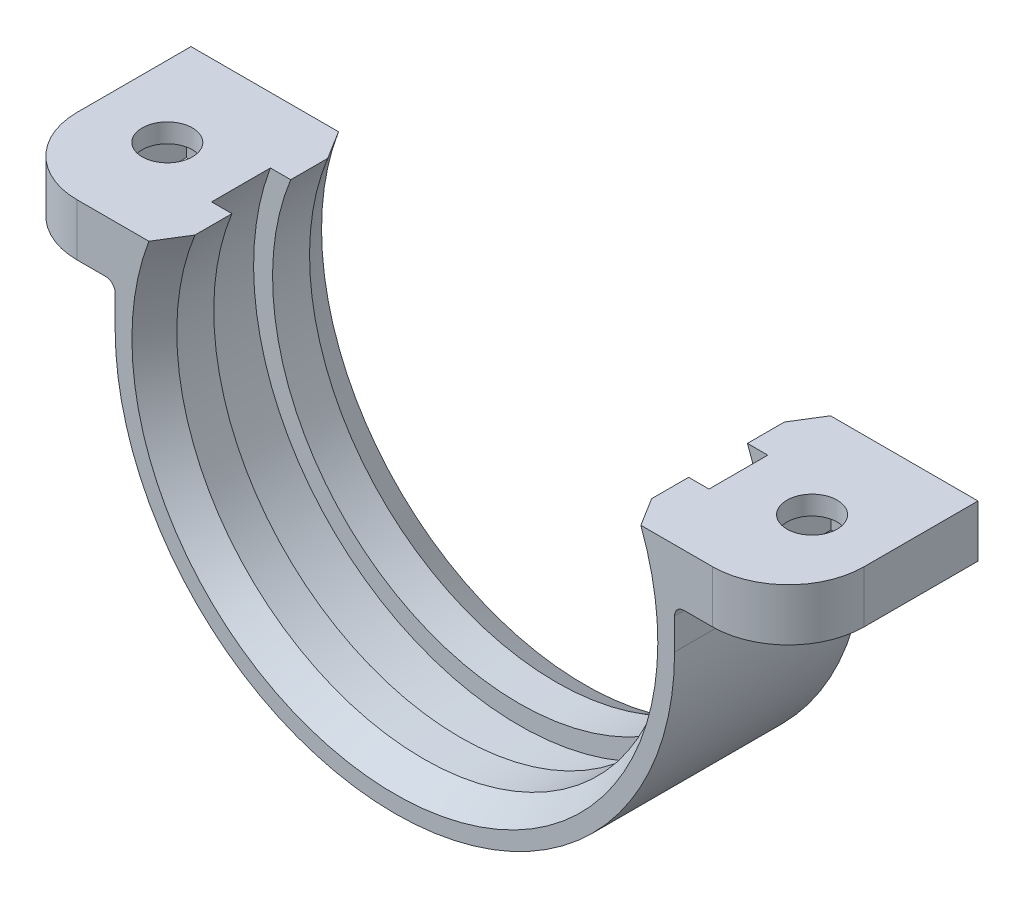
ISO-10303-21;
HEADER;
FILE_DESCRIPTION(('STEP AP214'),'2;1');
FILE_NAME('part.step','',(''),(''),'','','');
FILE_SCHEMA(('AUTOMOTIVE_DESIGN { 1 0 10303 214 1 1 1 1 }'));
ENDSEC;
DATA;
#1=APPLICATION_CONTEXT('core data for automotive mechanical design processes');
#2=APPLICATION_PROTOCOL_DEFINITION('international standard','automotive_design',2000,#1);
#3=PRODUCT_CONTEXT('',#1,'mechanical');
#4=PRODUCT('Part','Part','',(#3));
#5=PRODUCT_RELATED_PRODUCT_CATEGORY('part','',(#4));
#6=PRODUCT_DEFINITION_FORMATION('','',#4);
#7=PRODUCT_DEFINITION_CONTEXT('part definition',#1,'design');
#8=PRODUCT_DEFINITION('design','',#6,#7);
#9=PRODUCT_DEFINITION_SHAPE('','',#8);
#10=(LENGTH_UNIT() NAMED_UNIT(*) SI_UNIT(.MILLI.,.METRE.));
#11=(NAMED_UNIT(*) PLANE_ANGLE_UNIT() SI_UNIT($,.RADIAN.));
#12=(NAMED_UNIT(*) SI_UNIT($,.STERADIAN.) SOLID_ANGLE_UNIT());
#13=UNCERTAINTY_MEASURE_WITH_UNIT(LENGTH_MEASURE(1.E-05),#10,'distance_accuracy_value','');
#14=(GEOMETRIC_REPRESENTATION_CONTEXT(3) GLOBAL_UNCERTAINTY_ASSIGNED_CONTEXT((#13)) GLOBAL_UNIT_ASSIGNED_CONTEXT((#10,
#11,#12)) REPRESENTATION_CONTEXT('',''));
#15=CARTESIAN_POINT('',(0.,0.,0.));
#16=DIRECTION('',(0.,0.,1.));
#17=DIRECTION('',(1.,0.,0.));
#18=AXIS2_PLACEMENT_3D('',#15,#16,#17);
#19=CARTESIAN_POINT('',(41.5,-10.7,0.));
#20=DIRECTION('',(0.,1.,0.));
#21=DIRECTION('',(0.,0.,1.));
#22=AXIS2_PLACEMENT_3D('',#19,#20,#21);
#23=PLANE('',#22);
#24=DIRECTION('',(-1.,0.,0.));
#25=VECTOR('',#24,1.);
#26=CARTESIAN_POINT('',(41.5,-10.7,150.));
#27=LINE('',#26,#25);
#28=CARTESIAN_POINT('',(33.5,-10.7,150.));
#29=VERTEX_POINT('',#28);
#30=CARTESIAN_POINT('',(30.5,-10.7,150.));
#31=VERTEX_POINT('',#30);
#32=EDGE_CURVE('E388',#29,#31,#27,.T.);
#33=ORIENTED_EDGE('',*,*,#32,.T.);
#34=DIRECTION('',(0.,0.,-1.));
#35=VECTOR('',#34,1.);
#36=CARTESIAN_POINT('',(30.5,-10.7,0.));
#37=LINE('',#36,#35);
#38=CARTESIAN_POINT('',(30.5,-10.7,130.));
#39=VERTEX_POINT('',#38);
#40=EDGE_CURVE('E579',#31,#39,#37,.T.);
#41=ORIENTED_EDGE('',*,*,#40,.T.);
#42=DIRECTION('',(-1.,0.,0.));
#43=VECTOR('',#42,1.);
#44=CARTESIAN_POINT('',(41.5,-10.7,130.));
#45=LINE('',#44,#43);
#46=CARTESIAN_POINT('',(41.5,-10.7,130.));
#47=VERTEX_POINT('',#46);
#48=EDGE_CURVE('E346',#47,#39,#45,.T.);
#49=ORIENTED_EDGE('',*,*,#48,.F.);
#50=DIRECTION('',(0.,0.,-1.));
#51=VECTOR('',#50,1.);
#52=CARTESIAN_POINT('',(41.5,-10.7,0.));
#53=LINE('',#52,#51);
#54=CARTESIAN_POINT('',(41.5,-10.7,142.));
#55=VERTEX_POINT('',#54);
#56=EDGE_CURVE('E384',#55,#47,#53,.T.);
#57=ORIENTED_EDGE('',*,*,#56,.F.);
#58=CARTESIAN_POINT('',(33.5,-10.7,142.));
#59=DIRECTION('',(0.,1.,0.));
#60=DIRECTION('',(0.,0.,1.));
#61=AXIS2_PLACEMENT_3D('',#58,#59,#60);
#62=CIRCLE('',#61,8.);
#63=EDGE_CURVE('E418',#55,#29,#62,.F.);
#64=ORIENTED_EDGE('',*,*,#63,.T.);
#65=EDGE_LOOP('',(#33,#41,#49,#57,#64));
#66=FACE_BOUND('',#65,.T.);
#67=DIRECTION('',(0.,0.,-1.));
#68=VECTOR('',#67,1.);
#69=CARTESIAN_POINT('',(30.9,-10.7,0.));
#70=LINE('',#69,#68);
#71=CARTESIAN_POINT('',(30.9,-10.7,145.1));
#72=VERTEX_POINT('',#71);
#73=CARTESIAN_POINT('',(30.9,-10.7,134.9));
#74=VERTEX_POINT('',#73);
#75=EDGE_CURVE('E11',#72,#74,#70,.T.);
#76=ORIENTED_EDGE('',*,*,#75,.F.);
#77=DIRECTION('',(-1.,0.,0.));
#78=VECTOR('',#77,1.);
#79=CARTESIAN_POINT('',(41.5,-10.7,145.1));
#80=LINE('',#79,#78);
#81=CARTESIAN_POINT('',(37.1,-10.7,145.1));
#82=VERTEX_POINT('',#81);
#83=EDGE_CURVE('E237',#82,#72,#80,.T.);
#84=ORIENTED_EDGE('',*,*,#83,.F.);
#85=DIRECTION('',(0.,0.,1.));
#86=VECTOR('',#85,1.);
#87=CARTESIAN_POINT('',(37.1,-10.7,0.));
#88=LINE('',#87,#86);
#89=CARTESIAN_POINT('',(37.1,-10.7,134.9));
#90=VERTEX_POINT('',#89);
#91=EDGE_CURVE('E474',#90,#82,#88,.T.);
#92=ORIENTED_EDGE('',*,*,#91,.F.);
#93=DIRECTION('',(1.,0.,0.));
#94=VECTOR('',#93,1.);
#95=CARTESIAN_POINT('',(41.5,-10.7,134.9));
#96=LINE('',#95,#94);
#97=EDGE_CURVE('E51',#74,#90,#96,.T.);
#98=ORIENTED_EDGE('',*,*,#97,.F.);
#99=EDGE_LOOP('',(#76,#84,#92,#98));
#100=FACE_BOUND('',#99,.T.);
#101=ADVANCED_FACE('F43',(#66,#100),#23,.F.);
#102=CARTESIAN_POINT('',(-41.5,0.,0.));
#103=DIRECTION('',(1.,0.,0.));
#104=DIRECTION('',(0.,0.,1.));
#105=AXIS2_PLACEMENT_3D('',#102,#103,#104);
#106=PLANE('',#105);
#107=DIRECTION('',(0.,-1.,0.));
#108=VECTOR('',#107,1.);
#109=CARTESIAN_POINT('',(-41.5,-1.2838083835242E-13,142.));
#110=LINE('',#109,#108);
#111=CARTESIAN_POINT('',(-41.5,-10.7,142.));
#112=VERTEX_POINT('',#111);
#113=CARTESIAN_POINT('',(-41.5,-5.2,142.));
#114=VERTEX_POINT('',#113);
#115=EDGE_CURVE('E391',#112,#114,#110,.F.);
#116=ORIENTED_EDGE('',*,*,#115,.T.);
#117=DIRECTION('',(0.,0.,-1.));
#118=VECTOR('',#117,1.);
#119=CARTESIAN_POINT('',(-41.5,-5.2,0.));
#120=LINE('',#119,#118);
#121=CARTESIAN_POINT('',(-41.5,-5.2,130.));
#122=VERTEX_POINT('',#121);
#123=EDGE_CURVE('E321',#114,#122,#120,.T.);
#124=ORIENTED_EDGE('',*,*,#123,.T.);
#125=DIRECTION('',(0.,-1.,0.));
#126=VECTOR('',#125,1.);
#127=CARTESIAN_POINT('',(-41.5,-4.7,130.));
#128=LINE('',#127,#126);
#129=CARTESIAN_POINT('',(-41.5,-10.7,130.));
#130=VERTEX_POINT('',#129);
#131=EDGE_CURVE('E339',#122,#130,#128,.T.);
#132=ORIENTED_EDGE('',*,*,#131,.T.);
#133=DIRECTION('',(0.,0.,-1.));
#134=VECTOR('',#133,1.);
#135=CARTESIAN_POINT('',(-41.5,-10.7,0.));
#136=LINE('',#135,#134);
#137=EDGE_CURVE('E358',#112,#130,#136,.T.);
#138=ORIENTED_EDGE('',*,*,#137,.F.);
#139=EDGE_LOOP('',(#116,#124,#132,#138));
#140=FACE_BOUND('',#139,.T.);
#141=ADVANCED_FACE('F484',(#140),#106,.F.);
#142=CARTESIAN_POINT('',(-41.5,-10.7,0.));
#143=DIRECTION('',(0.,-1.,0.));
#144=DIRECTION('',(0.,0.,-1.));
#145=AXIS2_PLACEMENT_3D('',#142,#143,#144);
#146=PLANE('',#145);
#147=DIRECTION('',(0.,0.,1.));
#148=VECTOR('',#147,1.);
#149=CARTESIAN_POINT('',(-30.9,-10.7,0.));
#150=LINE('',#149,#148);
#151=CARTESIAN_POINT('',(-30.9,-10.7,134.9));
#152=VERTEX_POINT('',#151);
#153=CARTESIAN_POINT('',(-30.9,-10.7,145.1));
#154=VERTEX_POINT('',#153);
#155=EDGE_CURVE('E471',#152,#154,#150,.T.);
#156=ORIENTED_EDGE('',*,*,#155,.F.);
#157=DIRECTION('',(1.,0.,0.));
#158=VECTOR('',#157,1.);
#159=CARTESIAN_POINT('',(-41.5,-10.7,134.9));
#160=LINE('',#159,#158);
#161=CARTESIAN_POINT('',(-37.1,-10.7,134.9));
#162=VERTEX_POINT('',#161);
#163=EDGE_CURVE('E465',#162,#152,#160,.T.);
#164=ORIENTED_EDGE('',*,*,#163,.F.);
#165=DIRECTION('',(0.,0.,-1.));
#166=VECTOR('',#165,1.);
#167=CARTESIAN_POINT('',(-37.1,-10.7,0.));
#168=LINE('',#167,#166);
#169=CARTESIAN_POINT('',(-37.1,-10.7,145.1));
#170=VERTEX_POINT('',#169);
#171=EDGE_CURVE('E467',#170,#162,#168,.T.);
#172=ORIENTED_EDGE('',*,*,#171,.F.);
#173=DIRECTION('',(-1.,0.,0.));
#174=VECTOR('',#173,1.);
#175=CARTESIAN_POINT('',(-41.5,-10.7,145.1));
#176=LINE('',#175,#174);
#177=EDGE_CURVE('E469',#154,#170,#176,.T.);
#178=ORIENTED_EDGE('',*,*,#177,.F.);
#179=EDGE_LOOP('',(#156,#164,#172,#178));
#180=FACE_BOUND('',#179,.T.);
#181=DIRECTION('',(1.,0.,0.));
#182=VECTOR('',#181,1.);
#183=CARTESIAN_POINT('',(-41.5,-10.7,130.));
#184=LINE('',#183,#182);
#185=CARTESIAN_POINT('',(-30.5,-10.7,130.));
#186=VERTEX_POINT('',#185);
#187=EDGE_CURVE('E342',#130,#186,#184,.T.);
#188=ORIENTED_EDGE('',*,*,#187,.T.);
#189=DIRECTION('',(0.,0.,-1.));
#190=VECTOR('',#189,1.);
#191=CARTESIAN_POINT('',(-30.5,-10.7,0.));
#192=LINE('',#191,#190);
#193=CARTESIAN_POINT('',(-30.5,-10.7,150.));
#194=VERTEX_POINT('',#193);
#195=EDGE_CURVE('E447',#186,#194,#192,.F.);
#196=ORIENTED_EDGE('',*,*,#195,.T.);
#197=DIRECTION('',(1.,0.,0.));
#198=VECTOR('',#197,1.);
#199=CARTESIAN_POINT('',(-41.5,-10.7,150.));
#200=LINE('',#199,#198);
#201=CARTESIAN_POINT('',(-33.5,-10.7,150.));
#202=VERTEX_POINT('',#201);
#203=EDGE_CURVE('E361',#202,#194,#200,.T.);
#204=ORIENTED_EDGE('',*,*,#203,.F.);
#205=CARTESIAN_POINT('',(-33.5,-10.7,142.));
#206=DIRECTION('',(0.,-1.,0.));
#207=DIRECTION('',(0.,0.,-1.));
#208=AXIS2_PLACEMENT_3D('',#205,#206,#207);
#209=CIRCLE('',#208,8.);
#210=EDGE_CURVE('E394',#202,#112,#209,.T.);
#211=ORIENTED_EDGE('',*,*,#210,.T.);
#212=ORIENTED_EDGE('',*,*,#137,.T.);
#213=EDGE_LOOP('',(#188,#196,#204,#211,#212));
#214=FACE_BOUND('',#213,.T.);
#215=ADVANCED_FACE('F445',(#180,#214),#146,.T.);
#216=CARTESIAN_POINT('',(0.,-15.,130.));
#217=DIRECTION('',(0.,0.,1.));
#218=DIRECTION('',(1.,0.,0.));
#219=AXIS2_PLACEMENT_3D('',#216,#217,#218);
#220=CYLINDRICAL_SURFACE('',#219,26.);
#221=DIRECTION('',(0.,0.,1.));
#222=VECTOR('',#221,1.);
#223=CARTESIAN_POINT('',(-24.0823586884674,-5.2,130.));
#224=LINE('',#223,#222);
#225=CARTESIAN_POINT('',(-24.0823586884674,-5.2,143.1));
#226=VERTEX_POINT('',#225);
#227=CARTESIAN_POINT('',(-24.0823586884674,-5.2,147.));
#228=VERTEX_POINT('',#227);
#229=EDGE_CURVE('E310',#226,#228,#224,.T.);
#230=ORIENTED_EDGE('',*,*,#229,.T.);
#231=CARTESIAN_POINT('',(0.,-15.,147.));
#232=DIRECTION('',(0.,0.,-1.));
#233=DIRECTION('',(-1.,0.,0.));
#234=AXIS2_PLACEMENT_3D('',#231,#232,#233);
#235=CIRCLE('',#234,26.);
#236=CARTESIAN_POINT('',(24.0823586884674,-5.2,147.));
#237=VERTEX_POINT('',#236);
#238=EDGE_CURVE('E537',#228,#237,#235,.F.);
#239=ORIENTED_EDGE('',*,*,#238,.T.);
#240=DIRECTION('',(0.,0.,1.));
#241=VECTOR('',#240,1.);
#242=CARTESIAN_POINT('',(24.0823586884674,-5.2,130.));
#243=LINE('',#242,#241);
#244=CARTESIAN_POINT('',(24.0823586884674,-5.2,143.1));
#245=VERTEX_POINT('',#244);
#246=EDGE_CURVE('E332',#237,#245,#243,.F.);
#247=ORIENTED_EDGE('',*,*,#246,.T.);
#248=CARTESIAN_POINT('',(0.,-15.,143.1));
#249=DIRECTION('',(0.,0.,-1.));
#250=DIRECTION('',(-1.,0.,0.));
#251=AXIS2_PLACEMENT_3D('',#248,#249,#250);
#252=CIRCLE('',#251,26.);
#253=EDGE_CURVE('E362',#226,#245,#252,.F.);
#254=ORIENTED_EDGE('',*,*,#253,.F.);
#255=EDGE_LOOP('',(#230,#239,#247,#254));
#256=FACE_BOUND('',#255,.T.);
#257=ADVANCED_FACE('F609',(#256),#220,.F.);
#258=DIRECTION('',(0.,0.,1.));
#259=VECTOR('',#258,1.);
#260=CARTESIAN_POINT('',(24.0823586884674,-5.2,130.));
#261=LINE('',#260,#259);
#262=CARTESIAN_POINT('',(24.0823586884674,-5.2,136.9));
#263=VERTEX_POINT('',#262);
#264=CARTESIAN_POINT('',(24.0823586884674,-5.2,133.));
#265=VERTEX_POINT('',#264);
#266=EDGE_CURVE('E329',#263,#265,#261,.F.);
#267=ORIENTED_EDGE('',*,*,#266,.T.);
#268=CARTESIAN_POINT('',(0.,-15.,133.));
#269=DIRECTION('',(0.,0.,1.));
#270=DIRECTION('',(1.,0.,0.));
#271=AXIS2_PLACEMENT_3D('',#268,#269,#270);
#272=CIRCLE('',#271,26.);
#273=CARTESIAN_POINT('',(-24.0823586884674,-5.2,133.));
#274=VERTEX_POINT('',#273);
#275=EDGE_CURVE('E625',#265,#274,#272,.F.);
#276=ORIENTED_EDGE('',*,*,#275,.T.);
#277=DIRECTION('',(0.,0.,1.));
#278=VECTOR('',#277,1.);
#279=CARTESIAN_POINT('',(-24.0823586884674,-5.2,130.));
#280=LINE('',#279,#278);
#281=CARTESIAN_POINT('',(-24.0823586884674,-5.2,136.9));
#282=VERTEX_POINT('',#281);
#283=EDGE_CURVE('E306',#274,#282,#280,.T.);
#284=ORIENTED_EDGE('',*,*,#283,.T.);
#285=CARTESIAN_POINT('',(0.,-15.,136.9));
#286=DIRECTION('',(0.,0.,1.));
#287=DIRECTION('',(1.,0.,0.));
#288=AXIS2_PLACEMENT_3D('',#285,#286,#287);
#289=CIRCLE('',#288,26.);
#290=EDGE_CURVE('E357',#263,#282,#289,.F.);
#291=ORIENTED_EDGE('',*,*,#290,.F.);
#292=EDGE_LOOP('',(#267,#276,#284,#291));
#293=FACE_BOUND('',#292,.T.);
#294=ADVANCED_FACE('F498',(#293),#220,.F.);
#295=CARTESIAN_POINT('',(41.5,20.,150.));
#296=DIRECTION('',(0.,0.,-1.));
#297=DIRECTION('',(0.,1.,0.));
#298=AXIS2_PLACEMENT_3D('',#295,#296,#297);
#299=PLANE('',#298);
#300=DIRECTION('',(-1.,0.,0.));
#301=VECTOR('',#300,1.);
#302=CARTESIAN_POINT('',(41.5,-5.2,150.));
#303=LINE('',#302,#301);
#304=CARTESIAN_POINT('',(33.5,-5.2,150.));
#305=VERTEX_POINT('',#304);
#306=CARTESIAN_POINT('',(25.9427570237548,-5.2,150.));
#307=VERTEX_POINT('',#306);
#308=EDGE_CURVE('E322',#305,#307,#303,.T.);
#309=ORIENTED_EDGE('',*,*,#308,.T.);
#310=CARTESIAN_POINT('',(0.,-15.,150.));
#311=DIRECTION('',(0.,0.,-1.));
#312=DIRECTION('',(0.,1.,0.));
#313=AXIS2_PLACEMENT_3D('',#310,#311,#312);
#314=CIRCLE('',#313,27.7320508075689);
#315=CARTESIAN_POINT('',(-25.9427570237548,-5.2,150.));
#316=VERTEX_POINT('',#315);
#317=EDGE_CURVE('E572',#307,#316,#314,.T.);
#318=ORIENTED_EDGE('',*,*,#317,.T.);
#319=CARTESIAN_POINT('',(-33.5,-5.2,150.));
#320=VERTEX_POINT('',#319);
#321=EDGE_CURVE('E317',#316,#320,#303,.T.);
#322=ORIENTED_EDGE('',*,*,#321,.T.);
#323=DIRECTION('',(0.,-1.,0.));
#324=VECTOR('',#323,1.);
#325=CARTESIAN_POINT('',(-33.5,20.,150.));
#326=LINE('',#325,#324);
#327=EDGE_CURVE('E413',#320,#202,#326,.T.);
#328=ORIENTED_EDGE('',*,*,#327,.T.);
#329=ORIENTED_EDGE('',*,*,#203,.T.);
#330=CARTESIAN_POINT('',(-30.5,-11.7,150.));
#331=DIRECTION('',(0.,0.,-1.));
#332=DIRECTION('',(0.,1.,0.));
#333=AXIS2_PLACEMENT_3D('',#330,#331,#332);
#334=CIRCLE('',#333,1.);
#335=CARTESIAN_POINT('',(-29.5,-11.7,150.));
#336=VERTEX_POINT('',#335);
#337=EDGE_CURVE('E463',#194,#336,#334,.T.);
#338=ORIENTED_EDGE('',*,*,#337,.T.);
#339=DIRECTION('',(0.,-1.,0.));
#340=VECTOR('',#339,1.);
#341=CARTESIAN_POINT('',(-29.5,20.,150.));
#342=LINE('',#341,#340);
#343=CARTESIAN_POINT('',(-29.5,-15.,150.));
#344=VERTEX_POINT('',#343);
#345=EDGE_CURVE('E379',#336,#344,#342,.T.);
#346=ORIENTED_EDGE('',*,*,#345,.T.);
#347=CARTESIAN_POINT('',(0.,-15.,150.));
#348=DIRECTION('',(0.,0.,1.));
#349=DIRECTION('',(1.,0.,0.));
#350=AXIS2_PLACEMENT_3D('',#347,#348,#349);
#351=CIRCLE('',#350,29.5);
#352=CARTESIAN_POINT('',(29.5,-15.,150.));
#353=VERTEX_POINT('',#352);
#354=EDGE_CURVE('E365',#344,#353,#351,.T.);
#355=ORIENTED_EDGE('',*,*,#354,.T.);
#356=DIRECTION('',(0.,-1.,0.));
#357=VECTOR('',#356,1.);
#358=CARTESIAN_POINT('',(29.5,20.,150.));
#359=LINE('',#358,#357);
#360=CARTESIAN_POINT('',(29.5,-11.7,150.));
#361=VERTEX_POINT('',#360);
#362=EDGE_CURVE('E382',#361,#353,#359,.T.);
#363=ORIENTED_EDGE('',*,*,#362,.F.);
#364=CARTESIAN_POINT('',(30.5,-11.7,150.));
#365=DIRECTION('',(0.,0.,-1.));
#366=DIRECTION('',(0.,1.,0.));
#367=AXIS2_PLACEMENT_3D('',#364,#365,#366);
#368=CIRCLE('',#367,1.);
#369=EDGE_CURVE('E453',#361,#31,#368,.T.);
#370=ORIENTED_EDGE('',*,*,#369,.T.);
#371=ORIENTED_EDGE('',*,*,#32,.F.);
#372=DIRECTION('',(0.,-1.,0.));
#373=VECTOR('',#372,1.);
#374=CARTESIAN_POINT('',(33.5,20.,150.));
#375=LINE('',#374,#373);
#376=EDGE_CURVE('E400',#29,#305,#375,.F.);
#377=ORIENTED_EDGE('',*,*,#376,.T.);
#378=EDGE_LOOP('',(#309,#318,#322,#328,#329,#338,#346,#355,#363,#370,#371,#377));
#379=FACE_BOUND('',#378,.T.);
#380=ADVANCED_FACE('F435',(#379),#299,.F.);
#381=CARTESIAN_POINT('',(0.,-15.,130.));
#382=DIRECTION('',(0.,0.,1.));
#383=DIRECTION('',(1.,0.,0.));
#384=AXIS2_PLACEMENT_3D('',#381,#382,#383);
#385=PLANE('',#384);
#386=DIRECTION('',(1.,0.,0.));
#387=VECTOR('',#386,1.);
#388=CARTESIAN_POINT('',(0.,-5.2,130.));
#389=LINE('',#388,#387);
#390=CARTESIAN_POINT('',(-25.9427570237549,-5.2,130.));
#391=VERTEX_POINT('',#390);
#392=EDGE_CURVE('E314',#122,#391,#389,.T.);
#393=ORIENTED_EDGE('',*,*,#392,.T.);
#394=CARTESIAN_POINT('',(0.,-15.,130.));
#395=DIRECTION('',(0.,0.,1.));
#396=DIRECTION('',(1.,0.,0.));
#397=AXIS2_PLACEMENT_3D('',#394,#395,#396);
#398=CIRCLE('',#397,27.7320508075689);
#399=CARTESIAN_POINT('',(25.9427570237549,-5.2,130.));
#400=VERTEX_POINT('',#399);
#401=EDGE_CURVE('E415',#391,#400,#398,.T.);
#402=ORIENTED_EDGE('',*,*,#401,.T.);
#403=CARTESIAN_POINT('',(41.5,-5.2,130.));
#404=VERTEX_POINT('',#403);
#405=EDGE_CURVE('E318',#400,#404,#389,.T.);
#406=ORIENTED_EDGE('',*,*,#405,.T.);
#407=DIRECTION('',(0.,-1.,0.));
#408=VECTOR('',#407,1.);
#409=CARTESIAN_POINT('',(41.5,-4.7,130.));
#410=LINE('',#409,#408);
#411=EDGE_CURVE('E340',#404,#47,#410,.T.);
#412=ORIENTED_EDGE('',*,*,#411,.T.);
#413=ORIENTED_EDGE('',*,*,#48,.T.);
#414=CARTESIAN_POINT('',(30.5,-11.7,130.));
#415=DIRECTION('',(0.,0.,1.));
#416=DIRECTION('',(1.,0.,0.));
#417=AXIS2_PLACEMENT_3D('',#414,#415,#416);
#418=CIRCLE('',#417,1.);
#419=CARTESIAN_POINT('',(29.5,-11.7,130.));
#420=VERTEX_POINT('',#419);
#421=EDGE_CURVE('E450',#39,#420,#418,.T.);
#422=ORIENTED_EDGE('',*,*,#421,.T.);
#423=DIRECTION('',(0.,1.,0.));
#424=VECTOR('',#423,1.);
#425=CARTESIAN_POINT('',(29.5,4.99999999999998,130.));
#426=LINE('',#425,#424);
#427=CARTESIAN_POINT('',(29.5,-15.,130.));
#428=VERTEX_POINT('',#427);
#429=EDGE_CURVE('E370',#428,#420,#426,.T.);
#430=ORIENTED_EDGE('',*,*,#429,.F.);
#431=CARTESIAN_POINT('',(0.,-15.,130.));
#432=DIRECTION('',(0.,0.,1.));
#433=DIRECTION('',(1.,0.,0.));
#434=AXIS2_PLACEMENT_3D('',#431,#432,#433);
#435=CIRCLE('',#434,29.5);
#436=CARTESIAN_POINT('',(-29.5,-15.,130.));
#437=VERTEX_POINT('',#436);
#438=EDGE_CURVE('E368',#437,#428,#435,.T.);
#439=ORIENTED_EDGE('',*,*,#438,.F.);
#440=DIRECTION('',(0.,-1.,0.));
#441=VECTOR('',#440,1.);
#442=CARTESIAN_POINT('',(-29.5,4.99999999999998,130.));
#443=LINE('',#442,#441);
#444=CARTESIAN_POINT('',(-29.5,-11.7,130.));
#445=VERTEX_POINT('',#444);
#446=EDGE_CURVE('E366',#445,#437,#443,.T.);
#447=ORIENTED_EDGE('',*,*,#446,.F.);
#448=CARTESIAN_POINT('',(-30.5,-11.7,130.));
#449=DIRECTION('',(0.,0.,1.));
#450=DIRECTION('',(1.,0.,0.));
#451=AXIS2_PLACEMENT_3D('',#448,#449,#450);
#452=CIRCLE('',#451,1.);
#453=EDGE_CURVE('E461',#445,#186,#452,.T.);
#454=ORIENTED_EDGE('',*,*,#453,.T.);
#455=ORIENTED_EDGE('',*,*,#187,.F.);
#456=ORIENTED_EDGE('',*,*,#131,.F.);
#457=EDGE_LOOP('',(#393,#402,#406,#412,#413,#422,#430,#439,#447,#454,#455,#456));
#458=FACE_BOUND('',#457,.T.);
#459=ADVANCED_FACE('F497',(#458),#385,.F.);
#460=CARTESIAN_POINT('',(41.5,0.,0.));
#461=DIRECTION('',(-1.,0.,0.));
#462=DIRECTION('',(0.,0.,1.));
#463=AXIS2_PLACEMENT_3D('',#460,#461,#462);
#464=PLANE('',#463);
#465=ORIENTED_EDGE('',*,*,#411,.F.);
#466=DIRECTION('',(0.,0.,1.));
#467=VECTOR('',#466,1.);
#468=CARTESIAN_POINT('',(41.5,-5.2,0.));
#469=LINE('',#468,#467);
#470=CARTESIAN_POINT('',(41.5,-5.2,142.));
#471=VERTEX_POINT('',#470);
#472=EDGE_CURVE('E336',#404,#471,#469,.T.);
#473=ORIENTED_EDGE('',*,*,#472,.T.);
#474=DIRECTION('',(0.,-1.,0.));
#475=VECTOR('',#474,1.);
#476=CARTESIAN_POINT('',(41.5,-1.2838083835242E-13,142.));
#477=LINE('',#476,#475);
#478=EDGE_CURVE('E416',#471,#55,#477,.T.);
#479=ORIENTED_EDGE('',*,*,#478,.T.);
#480=ORIENTED_EDGE('',*,*,#56,.T.);
#481=EDGE_LOOP('',(#465,#473,#479,#480));
#482=FACE_BOUND('',#481,.T.);
#483=ADVANCED_FACE('F493',(#482),#464,.F.);
#484=CARTESIAN_POINT('',(29.5,0.,0.));
#485=DIRECTION('',(1.,0.,0.));
#486=DIRECTION('',(0.,0.,-1.));
#487=AXIS2_PLACEMENT_3D('',#484,#485,#486);
#488=PLANE('',#487);
#489=ORIENTED_EDGE('',*,*,#429,.T.);
#490=DIRECTION('',(0.,0.,-1.));
#491=VECTOR('',#490,1.);
#492=CARTESIAN_POINT('',(29.5,-11.7,0.));
#493=LINE('',#492,#491);
#494=EDGE_CURVE('E456',#420,#361,#493,.F.);
#495=ORIENTED_EDGE('',*,*,#494,.T.);
#496=ORIENTED_EDGE('',*,*,#362,.T.);
#497=DIRECTION('',(0.,0.,1.));
#498=VECTOR('',#497,1.);
#499=CARTESIAN_POINT('',(29.5,-15.,130.));
#500=LINE('',#499,#498);
#501=EDGE_CURVE('E376',#428,#353,#500,.T.);
#502=ORIENTED_EDGE('',*,*,#501,.F.);
#503=EDGE_LOOP('',(#489,#495,#496,#502));
#504=FACE_BOUND('',#503,.T.);
#505=ADVANCED_FACE('F586',(#504),#488,.T.);
#506=CARTESIAN_POINT('',(0.,-15.,130.));
#507=DIRECTION('',(0.,0.,1.));
#508=DIRECTION('',(1.,0.,0.));
#509=AXIS2_PLACEMENT_3D('',#506,#507,#508);
#510=CYLINDRICAL_SURFACE('',#509,29.5);
#511=ORIENTED_EDGE('',*,*,#354,.F.);
#512=DIRECTION('',(0.,0.,1.));
#513=VECTOR('',#512,1.);
#514=CARTESIAN_POINT('',(-29.5,-15.,130.));
#515=LINE('',#514,#513);
#516=EDGE_CURVE('E373',#437,#344,#515,.T.);
#517=ORIENTED_EDGE('',*,*,#516,.F.);
#518=ORIENTED_EDGE('',*,*,#438,.T.);
#519=ORIENTED_EDGE('',*,*,#501,.T.);
#520=EDGE_LOOP('',(#511,#517,#518,#519));
#521=FACE_BOUND('',#520,.T.);
#522=ADVANCED_FACE('F602',(#521),#510,.T.);
#523=CARTESIAN_POINT('',(-29.5,0.,0.));
#524=DIRECTION('',(1.,0.,0.));
#525=DIRECTION('',(0.,0.,-1.));
#526=AXIS2_PLACEMENT_3D('',#523,#524,#525);
#527=PLANE('',#526);
#528=ORIENTED_EDGE('',*,*,#345,.F.);
#529=DIRECTION('',(0.,0.,-1.));
#530=VECTOR('',#529,1.);
#531=CARTESIAN_POINT('',(-29.5,-11.7,0.));
#532=LINE('',#531,#530);
#533=EDGE_CURVE('E451',#336,#445,#532,.T.);
#534=ORIENTED_EDGE('',*,*,#533,.T.);
#535=ORIENTED_EDGE('',*,*,#446,.T.);
#536=ORIENTED_EDGE('',*,*,#516,.T.);
#537=EDGE_LOOP('',(#528,#534,#535,#536));
#538=FACE_BOUND('',#537,.T.);
#539=ADVANCED_FACE('F502',(#538),#527,.F.);
#540=CARTESIAN_POINT('',(-33.5,20.,142.));
#541=DIRECTION('',(0.,-1.,0.));
#542=DIRECTION('',(0.,0.,-1.));
#543=AXIS2_PLACEMENT_3D('',#540,#541,#542);
#544=CYLINDRICAL_SURFACE('',#543,8.);
#545=CARTESIAN_POINT('',(-33.5,-5.2,142.));
#546=DIRECTION('',(0.,-1.,0.));
#547=DIRECTION('',(0.,0.,-1.));
#548=AXIS2_PLACEMENT_3D('',#545,#546,#547);
#549=CIRCLE('',#548,8.);
#550=EDGE_CURVE('E325',#114,#320,#549,.F.);
#551=ORIENTED_EDGE('',*,*,#550,.F.);
#552=ORIENTED_EDGE('',*,*,#115,.F.);
#553=ORIENTED_EDGE('',*,*,#210,.F.);
#554=ORIENTED_EDGE('',*,*,#327,.F.);
#555=EDGE_LOOP('',(#551,#552,#553,#554));
#556=FACE_BOUND('',#555,.T.);
#557=ADVANCED_FACE('F442',(#556),#544,.T.);
#558=CARTESIAN_POINT('',(33.5,-1.2838083835242E-13,142.));
#559=DIRECTION('',(0.,-1.,0.));
#560=DIRECTION('',(0.,0.,-1.));
#561=AXIS2_PLACEMENT_3D('',#558,#559,#560);
#562=CYLINDRICAL_SURFACE('',#561,8.);
#563=CARTESIAN_POINT('',(33.5,-5.2,142.));
#564=DIRECTION('',(0.,-1.,0.));
#565=DIRECTION('',(0.,0.,-1.));
#566=AXIS2_PLACEMENT_3D('',#563,#564,#565);
#567=CIRCLE('',#566,8.);
#568=EDGE_CURVE('E334',#305,#471,#567,.F.);
#569=ORIENTED_EDGE('',*,*,#568,.F.);
#570=ORIENTED_EDGE('',*,*,#376,.F.);
#571=ORIENTED_EDGE('',*,*,#63,.F.);
#572=ORIENTED_EDGE('',*,*,#478,.F.);
#573=EDGE_LOOP('',(#569,#570,#571,#572));
#574=FACE_BOUND('',#573,.T.);
#575=ADVANCED_FACE('F501',(#574),#562,.T.);
#576=CARTESIAN_POINT('',(0.,13.,143.1));
#577=DIRECTION('',(0.,0.,-1.));
#578=DIRECTION('',(-1.,0.,0.));
#579=AXIS2_PLACEMENT_3D('',#576,#577,#578);
#580=PLANE('',#579);
#581=DIRECTION('',(-1.,0.,0.));
#582=VECTOR('',#581,1.);
#583=CARTESIAN_POINT('',(0.,-5.2,143.1));
#584=LINE('',#583,#582);
#585=CARTESIAN_POINT('',(26.2289915932733,-5.2,143.1));
#586=VERTEX_POINT('',#585);
#587=EDGE_CURVE('E307',#586,#245,#584,.T.);
#588=ORIENTED_EDGE('',*,*,#587,.F.);
#589=CARTESIAN_POINT('',(0.,-15.,143.1));
#590=DIRECTION('',(0.,0.,1.));
#591=DIRECTION('',(1.,0.,0.));
#592=AXIS2_PLACEMENT_3D('',#589,#590,#591);
#593=CIRCLE('',#592,28.);
#594=CARTESIAN_POINT('',(-26.2289915932733,-5.2,143.1));
#595=VERTEX_POINT('',#594);
#596=EDGE_CURVE('E349',#595,#586,#593,.T.);
#597=ORIENTED_EDGE('',*,*,#596,.F.);
#598=EDGE_CURVE('E302',#226,#595,#584,.T.);
#599=ORIENTED_EDGE('',*,*,#598,.F.);
#600=ORIENTED_EDGE('',*,*,#253,.T.);
#601=EDGE_LOOP('',(#588,#597,#599,#600));
#602=FACE_BOUND('',#601,.T.);
#603=ADVANCED_FACE('F505',(#602),#580,.T.);
#604=CARTESIAN_POINT('',(0.,13.,136.9));
#605=DIRECTION('',(0.,0.,1.));
#606=DIRECTION('',(1.,0.,0.));
#607=AXIS2_PLACEMENT_3D('',#604,#605,#606);
#608=PLANE('',#607);
#609=DIRECTION('',(1.,0.,0.));
#610=VECTOR('',#609,1.);
#611=CARTESIAN_POINT('',(0.,-5.2,136.9));
#612=LINE('',#611,#610);
#613=CARTESIAN_POINT('',(-26.2289915932733,-5.2,136.9));
#614=VERTEX_POINT('',#613);
#615=EDGE_CURVE('E294',#614,#282,#612,.T.);
#616=ORIENTED_EDGE('',*,*,#615,.F.);
#617=CARTESIAN_POINT('',(0.,-15.,136.9));
#618=DIRECTION('',(0.,0.,1.));
#619=DIRECTION('',(1.,0.,0.));
#620=AXIS2_PLACEMENT_3D('',#617,#618,#619);
#621=CIRCLE('',#620,28.);
#622=CARTESIAN_POINT('',(26.2289915932733,-5.2,136.9));
#623=VERTEX_POINT('',#622);
#624=EDGE_CURVE('E353',#614,#623,#621,.T.);
#625=ORIENTED_EDGE('',*,*,#624,.T.);
#626=EDGE_CURVE('E303',#263,#623,#612,.T.);
#627=ORIENTED_EDGE('',*,*,#626,.F.);
#628=ORIENTED_EDGE('',*,*,#290,.T.);
#629=EDGE_LOOP('',(#616,#625,#627,#628));
#630=FACE_BOUND('',#629,.T.);
#631=ADVANCED_FACE('F643',(#630),#608,.T.);
#632=CARTESIAN_POINT('',(0.,-15.,143.1));
#633=DIRECTION('',(0.,0.,1.));
#634=DIRECTION('',(1.,0.,0.));
#635=AXIS2_PLACEMENT_3D('',#632,#633,#634);
#636=CYLINDRICAL_SURFACE('',#635,28.);
#637=DIRECTION('',(0.,0.,1.));
#638=VECTOR('',#637,1.);
#639=CARTESIAN_POINT('',(26.2289915932733,-5.2,143.1));
#640=LINE('',#639,#638);
#641=EDGE_CURVE('E412',#623,#586,#640,.T.);
#642=ORIENTED_EDGE('',*,*,#641,.F.);
#643=ORIENTED_EDGE('',*,*,#624,.F.);
#644=DIRECTION('',(0.,0.,1.));
#645=VECTOR('',#644,1.);
#646=CARTESIAN_POINT('',(-26.2289915932733,-5.2,143.1));
#647=LINE('',#646,#645);
#648=EDGE_CURVE('E409',#595,#614,#647,.F.);
#649=ORIENTED_EDGE('',*,*,#648,.F.);
#650=ORIENTED_EDGE('',*,*,#596,.T.);
#651=EDGE_LOOP('',(#642,#643,#649,#650));
#652=FACE_BOUND('',#651,.T.);
#653=ADVANCED_FACE('F549',(#652),#636,.F.);
#654=CARTESIAN_POINT('',(0.,-5.2,0.));
#655=DIRECTION('',(0.,-1.,0.));
#656=DIRECTION('',(0.,0.,-1.));
#657=AXIS2_PLACEMENT_3D('',#654,#655,#656);
#658=PLANE('',#657);
#659=CARTESIAN_POINT('',(-34.,-5.2,140.));
#660=DIRECTION('',(0.,1.,0.));
#661=DIRECTION('',(0.,0.,1.));
#662=AXIS2_PLACEMENT_3D('',#659,#660,#661);
#663=CIRCLE('',#662,2.65);
#664=CARTESIAN_POINT('',(-34.,-5.2,142.65));
#665=VERTEX_POINT('',#664);
#666=EDGE_CURVE('E291',#665,#665,#663,.T.);
#667=ORIENTED_EDGE('',*,*,#666,.F.);
#668=EDGE_LOOP('',(#667));
#669=FACE_BOUND('',#668,.T.);
#670=ORIENTED_EDGE('',*,*,#283,.F.);
#671=CARTESIAN_POINT('',(-24.0823586884674,-5.2,133.));
#672=CARTESIAN_POINT('',(-24.2379668630579,-5.2,132.750356945767));
#673=CARTESIAN_POINT('',(-24.3934211147765,-5.2,132.500617975227));
#674=CARTESIAN_POINT('',(-24.7040370843501,-5.2,132.00095860122));
#675=CARTESIAN_POINT('',(-24.8591988025653,-5.2,131.751038197978));
#676=CARTESIAN_POINT('',(-25.1692453827941,-5.2,131.251025771402));
#677=CARTESIAN_POINT('',(-25.3241302448388,-5.2,131.000933748088));
#678=CARTESIAN_POINT('',(-25.6336372446535,-5.2,130.500586754858));
#679=CARTESIAN_POINT('',(-25.7882593820997,-5.2,130.250331784742));
#680=CARTESIAN_POINT('',(-25.9427570237549,-5.2,130.));
#681=B_SPLINE_CURVE_WITH_KNOTS('',3,(#671,#672,#673,#674,#675,#676,#677,#678,#679,#680),
.UNSPECIFIED.,.F.,.F.,(4,2,2,2,4),(0.,0.882507716188761,1.76501434550675,2.64752087561496,
3.53002849250413),.UNSPECIFIED.);
#682=EDGE_CURVE('E530',#274,#391,#681,.T.);
#683=ORIENTED_EDGE('',*,*,#682,.T.);
#684=ORIENTED_EDGE('',*,*,#392,.F.);
#685=ORIENTED_EDGE('',*,*,#123,.F.);
#686=ORIENTED_EDGE('',*,*,#550,.T.);
#687=ORIENTED_EDGE('',*,*,#321,.F.);
#688=CARTESIAN_POINT('',(-25.9427570237548,-5.2,150.));
#689=CARTESIAN_POINT('',(-25.7882593820996,-5.2,149.749668215258));
#690=CARTESIAN_POINT('',(-25.6336372446534,-5.2,149.499413245142));
#691=CARTESIAN_POINT('',(-25.3241302448387,-5.2,148.999066251912));
#692=CARTESIAN_POINT('',(-25.169245382794,-5.2,148.748974228598));
#693=CARTESIAN_POINT('',(-24.8591988025653,-5.2,148.248961802022));
#694=CARTESIAN_POINT('',(-24.7040370843501,-5.2,147.99904139878));
#695=CARTESIAN_POINT('',(-24.3934211147765,-5.2,147.499382024773));
#696=CARTESIAN_POINT('',(-24.2379668630579,-5.2,147.249643054233));
#697=CARTESIAN_POINT('',(-24.0823586884674,-5.2,147.));
#698=B_SPLINE_CURVE_WITH_KNOTS('',3,(#688,#689,#690,#691,#692,#693,#694,#695,#696,#697),
.UNSPECIFIED.,.F.,.F.,(4,2,2,2,4),(0.,0.882507616889183,1.76501414699732,2.64752077631534,
3.53002849250404),.UNSPECIFIED.);
#699=EDGE_CURVE('E538',#316,#228,#698,.T.);
#700=ORIENTED_EDGE('',*,*,#699,.T.);
#701=ORIENTED_EDGE('',*,*,#229,.F.);
#702=ORIENTED_EDGE('',*,*,#598,.T.);
#703=ORIENTED_EDGE('',*,*,#648,.T.);
#704=ORIENTED_EDGE('',*,*,#615,.T.);
#705=EDGE_LOOP('',(#670,#683,#684,#685,#686,#687,#700,#701,#702,#703,#704));
#706=FACE_BOUND('',#705,.T.);
#707=ADVANCED_FACE('F544',(#669,#706),#658,.F.);
#708=CARTESIAN_POINT('',(34.,-5.2,140.));
#709=DIRECTION('',(0.,1.,0.));
#710=DIRECTION('',(0.,0.,1.));
#711=AXIS2_PLACEMENT_3D('',#708,#709,#710);
#712=CIRCLE('',#711,2.65);
#713=CARTESIAN_POINT('',(34.,-5.2,142.65));
#714=VERTEX_POINT('',#713);
#715=EDGE_CURVE('E290',#714,#714,#712,.T.);
#716=ORIENTED_EDGE('',*,*,#715,.F.);
#717=EDGE_LOOP('',(#716));
#718=FACE_BOUND('',#717,.T.);
#719=ORIENTED_EDGE('',*,*,#405,.F.);
#720=CARTESIAN_POINT('',(25.9427570237549,-5.2,130.));
#721=CARTESIAN_POINT('',(25.7882593820997,-5.2,130.250331784742));
#722=CARTESIAN_POINT('',(25.6336372446534,-5.2,130.500586754858));
#723=CARTESIAN_POINT('',(25.3241302448387,-5.2,131.000933748088));
#724=CARTESIAN_POINT('',(25.1692453827941,-5.2,131.251025771402));
#725=CARTESIAN_POINT('',(24.8591988025653,-5.2,131.751038197978));
#726=CARTESIAN_POINT('',(24.7040370843502,-5.2,132.00095860122));
#727=CARTESIAN_POINT('',(24.3934211147765,-5.2,132.500617975227));
#728=CARTESIAN_POINT('',(24.2379668630579,-5.2,132.750356945767));
#729=CARTESIAN_POINT('',(24.0823586884674,-5.2,133.));
#730=B_SPLINE_CURVE_WITH_KNOTS('',3,(#720,#721,#722,#723,#724,#725,#726,#727,#728,#729),
.UNSPECIFIED.,.F.,.F.,(4,2,2,2,4),(0.,0.882507616889216,1.76501414699738,2.64752077631537,
3.53002849250413),.UNSPECIFIED.);
#731=EDGE_CURVE('E521',#400,#265,#730,.T.);
#732=ORIENTED_EDGE('',*,*,#731,.T.);
#733=ORIENTED_EDGE('',*,*,#266,.F.);
#734=ORIENTED_EDGE('',*,*,#626,.T.);
#735=ORIENTED_EDGE('',*,*,#641,.T.);
#736=ORIENTED_EDGE('',*,*,#587,.T.);
#737=ORIENTED_EDGE('',*,*,#246,.F.);
#738=CARTESIAN_POINT('',(24.0823586884674,-5.2,147.));
#739=CARTESIAN_POINT('',(24.2379668630579,-5.2,147.249643054233));
#740=CARTESIAN_POINT('',(24.3934211147765,-5.2,147.499382024773));
#741=CARTESIAN_POINT('',(24.7040370843502,-5.2,147.99904139878));
#742=CARTESIAN_POINT('',(24.8591988025653,-5.2,148.248961802022));
#743=CARTESIAN_POINT('',(25.169245382794,-5.2,148.748974228598));
#744=CARTESIAN_POINT('',(25.3241302448387,-5.2,148.999066251912));
#745=CARTESIAN_POINT('',(25.6336372446534,-5.2,149.499413245142));
#746=CARTESIAN_POINT('',(25.7882593820996,-5.2,149.749668215258));
#747=CARTESIAN_POINT('',(25.9427570237548,-5.2,150.));
#748=B_SPLINE_CURVE_WITH_KNOTS('',3,(#738,#739,#740,#741,#742,#743,#744,#745,#746,#747),
.UNSPECIFIED.,.F.,.F.,(4,2,2,2,4),(0.,0.882507716188761,1.76501434550672,2.64752087561486,
3.53002849250404),.UNSPECIFIED.);
#749=EDGE_CURVE('E556',#237,#307,#748,.T.);
#750=ORIENTED_EDGE('',*,*,#749,.T.);
#751=ORIENTED_EDGE('',*,*,#308,.F.);
#752=ORIENTED_EDGE('',*,*,#568,.T.);
#753=ORIENTED_EDGE('',*,*,#472,.F.);
#754=EDGE_LOOP('',(#719,#732,#733,#734,#735,#736,#737,#750,#751,#752,#753));
#755=FACE_BOUND('',#754,.T.);
#756=ADVANCED_FACE('F516',(#718,#755),#658,.F.);
#757=CARTESIAN_POINT('',(0.,-15.,130.));
#758=DIRECTION('',(0.,0.,-1.));
#759=DIRECTION('',(-1.,0.,0.));
#760=AXIS2_PLACEMENT_3D('',#757,#758,#759);
#761=CONICAL_SURFACE('',#760,27.7320508075689,0.523598775598293);
#762=ORIENTED_EDGE('',*,*,#682,.F.);
#763=ORIENTED_EDGE('',*,*,#275,.F.);
#764=ORIENTED_EDGE('',*,*,#731,.F.);
#765=ORIENTED_EDGE('',*,*,#401,.F.);
#766=EDGE_LOOP('',(#762,#763,#764,#765));
#767=FACE_BOUND('',#766,.T.);
#768=ADVANCED_FACE('F508',(#767),#761,.F.);
#769=CARTESIAN_POINT('',(0.,-15.,147.));
#770=DIRECTION('',(0.,0.,1.));
#771=DIRECTION('',(1.,0.,0.));
#772=AXIS2_PLACEMENT_3D('',#769,#770,#771);
#773=CONICAL_SURFACE('',#772,26.,0.523598775598296);
#774=ORIENTED_EDGE('',*,*,#699,.F.);
#775=ORIENTED_EDGE('',*,*,#317,.F.);
#776=ORIENTED_EDGE('',*,*,#749,.F.);
#777=ORIENTED_EDGE('',*,*,#238,.F.);
#778=EDGE_LOOP('',(#774,#775,#776,#777));
#779=FACE_BOUND('',#778,.T.);
#780=ADVANCED_FACE('F515',(#779),#773,.F.);
#781=CARTESIAN_POINT('',(30.5,-11.7,0.));
#782=DIRECTION('',(0.,0.,-1.));
#783=DIRECTION('',(0.,1.,0.));
#784=AXIS2_PLACEMENT_3D('',#781,#782,#783);
#785=CYLINDRICAL_SURFACE('',#784,1.);
#786=ORIENTED_EDGE('',*,*,#369,.F.);
#787=ORIENTED_EDGE('',*,*,#494,.F.);
#788=ORIENTED_EDGE('',*,*,#421,.F.);
#789=ORIENTED_EDGE('',*,*,#40,.F.);
#790=EDGE_LOOP('',(#786,#787,#788,#789));
#791=FACE_BOUND('',#790,.T.);
#792=ADVANCED_FACE('F593',(#791),#785,.F.);
#793=CARTESIAN_POINT('',(-30.5,-11.7,0.));
#794=DIRECTION('',(0.,0.,-1.));
#795=DIRECTION('',(0.,1.,0.));
#796=AXIS2_PLACEMENT_3D('',#793,#794,#795);
#797=CYLINDRICAL_SURFACE('',#796,1.);
#798=ORIENTED_EDGE('',*,*,#337,.F.);
#799=ORIENTED_EDGE('',*,*,#195,.F.);
#800=ORIENTED_EDGE('',*,*,#453,.F.);
#801=ORIENTED_EDGE('',*,*,#533,.F.);
#802=EDGE_LOOP('',(#798,#799,#800,#801));
#803=FACE_BOUND('',#802,.T.);
#804=ADVANCED_FACE('F45',(#803),#797,.F.);
#805=CARTESIAN_POINT('',(34.,-7.2,140.));
#806=DIRECTION('',(0.,1.,0.));
#807=DIRECTION('',(0.,0.,1.));
#808=AXIS2_PLACEMENT_3D('',#805,#806,#807);
#809=CYLINDRICAL_SURFACE('',#808,2.65);
#810=CARTESIAN_POINT('',(34.,-7.2,140.));
#811=DIRECTION('',(0.,1.,0.));
#812=DIRECTION('',(0.,0.,1.));
#813=AXIS2_PLACEMENT_3D('',#810,#811,#812);
#814=CIRCLE('',#813,2.65);
#815=CARTESIAN_POINT('',(34.,-7.2,142.65));
#816=VERTEX_POINT('',#815);
#817=EDGE_CURVE('E262',#816,#816,#814,.T.);
#818=ORIENTED_EDGE('',*,*,#817,.F.);
#819=EDGE_LOOP('',(#818));
#820=FACE_BOUND('',#819,.T.);
#821=ORIENTED_EDGE('',*,*,#715,.T.);
#822=EDGE_LOOP('',(#821));
#823=FACE_BOUND('',#822,.T.);
#824=ADVANCED_FACE('F551',(#820,#823),#809,.F.);
#825=CARTESIAN_POINT('',(-34.,-7.2,140.));
#826=DIRECTION('',(0.,1.,0.));
#827=DIRECTION('',(0.,0.,1.));
#828=AXIS2_PLACEMENT_3D('',#825,#826,#827);
#829=CYLINDRICAL_SURFACE('',#828,2.65);
#830=CARTESIAN_POINT('',(-34.,-7.2,140.));
#831=DIRECTION('',(0.,1.,0.));
#832=DIRECTION('',(0.,0.,1.));
#833=AXIS2_PLACEMENT_3D('',#830,#831,#832);
#834=CIRCLE('',#833,2.65);
#835=CARTESIAN_POINT('',(-34.,-7.2,142.65));
#836=VERTEX_POINT('',#835);
#837=EDGE_CURVE('E283',#836,#836,#834,.T.);
#838=ORIENTED_EDGE('',*,*,#837,.F.);
#839=EDGE_LOOP('',(#838));
#840=FACE_BOUND('',#839,.T.);
#841=ORIENTED_EDGE('',*,*,#666,.T.);
#842=EDGE_LOOP('',(#841));
#843=FACE_BOUND('',#842,.T.);
#844=ADVANCED_FACE('F701',(#840,#843),#829,.F.);
#845=CARTESIAN_POINT('',(0.,-7.2,0.));
#846=DIRECTION('',(0.,-1.,0.));
#847=DIRECTION('',(0.,0.,-1.));
#848=AXIS2_PLACEMENT_3D('',#845,#846,#847);
#849=PLANE('',#848);
#850=DIRECTION('',(0.,0.,-1.));
#851=VECTOR('',#850,1.);
#852=CARTESIAN_POINT('',(-30.9,-7.2,145.1));
#853=LINE('',#852,#851);
#854=CARTESIAN_POINT('',(-30.9,-7.2,145.1));
#855=VERTEX_POINT('',#854);
#856=CARTESIAN_POINT('',(-30.9,-7.2,134.9));
#857=VERTEX_POINT('',#856);
#858=EDGE_CURVE('E266',#855,#857,#853,.T.);
#859=ORIENTED_EDGE('',*,*,#858,.F.);
#860=DIRECTION('',(1.,0.,0.));
#861=VECTOR('',#860,1.);
#862=CARTESIAN_POINT('',(-37.1,-7.2,145.1));
#863=LINE('',#862,#861);
#864=CARTESIAN_POINT('',(-37.1,-7.2,145.1));
#865=VERTEX_POINT('',#864);
#866=EDGE_CURVE('E275',#865,#855,#863,.T.);
#867=ORIENTED_EDGE('',*,*,#866,.F.);
#868=DIRECTION('',(0.,0.,1.));
#869=VECTOR('',#868,1.);
#870=CARTESIAN_POINT('',(-37.1,-7.2,145.1));
#871=LINE('',#870,#869);
#872=CARTESIAN_POINT('',(-37.1,-7.2,134.9));
#873=VERTEX_POINT('',#872);
#874=EDGE_CURVE('E272',#873,#865,#871,.T.);
#875=ORIENTED_EDGE('',*,*,#874,.F.);
#876=DIRECTION('',(-1.,0.,0.));
#877=VECTOR('',#876,1.);
#878=CARTESIAN_POINT('',(-37.1,-7.2,134.9));
#879=LINE('',#878,#877);
#880=EDGE_CURVE('E270',#857,#873,#879,.T.);
#881=ORIENTED_EDGE('',*,*,#880,.F.);
#882=EDGE_LOOP('',(#859,#867,#875,#881));
#883=FACE_BOUND('',#882,.T.);
#884=ORIENTED_EDGE('',*,*,#837,.T.);
#885=EDGE_LOOP('',(#884));
#886=FACE_BOUND('',#885,.T.);
#887=ADVANCED_FACE('F708',(#883,#886),#849,.T.);
#888=CARTESIAN_POINT('',(-30.9,-44.5,145.1));
#889=DIRECTION('',(1.,0.,0.));
#890=DIRECTION('',(0.,0.,-1.));
#891=AXIS2_PLACEMENT_3D('',#888,#889,#890);
#892=PLANE('',#891);
#893=ORIENTED_EDGE('',*,*,#155,.T.);
#894=DIRECTION('',(0.,1.,0.));
#895=VECTOR('',#894,1.);
#896=CARTESIAN_POINT('',(-30.9,-44.5,145.1));
#897=LINE('',#896,#895);
#898=EDGE_CURVE('E280',#154,#855,#897,.T.);
#899=ORIENTED_EDGE('',*,*,#898,.T.);
#900=ORIENTED_EDGE('',*,*,#858,.T.);
#901=DIRECTION('',(0.,1.,0.));
#902=VECTOR('',#901,1.);
#903=CARTESIAN_POINT('',(-30.9,-44.5,134.9));
#904=LINE('',#903,#902);
#905=EDGE_CURVE('E279',#152,#857,#904,.T.);
#906=ORIENTED_EDGE('',*,*,#905,.F.);
#907=EDGE_LOOP('',(#893,#899,#900,#906));
#908=FACE_BOUND('',#907,.T.);
#909=ADVANCED_FACE('F715',(#908),#892,.F.);
#910=CARTESIAN_POINT('',(-37.1,-44.5,145.1));
#911=DIRECTION('',(0.,0.,1.));
#912=DIRECTION('',(1.,0.,0.));
#913=AXIS2_PLACEMENT_3D('',#910,#911,#912);
#914=PLANE('',#913);
#915=ORIENTED_EDGE('',*,*,#177,.T.);
#916=DIRECTION('',(0.,1.,0.));
#917=VECTOR('',#916,1.);
#918=CARTESIAN_POINT('',(-37.1,-44.5,145.1));
#919=LINE('',#918,#917);
#920=EDGE_CURVE('E284',#170,#865,#919,.T.);
#921=ORIENTED_EDGE('',*,*,#920,.T.);
#922=ORIENTED_EDGE('',*,*,#866,.T.);
#923=ORIENTED_EDGE('',*,*,#898,.F.);
#924=EDGE_LOOP('',(#915,#921,#922,#923));
#925=FACE_BOUND('',#924,.T.);
#926=ADVANCED_FACE('F723',(#925),#914,.F.);
#927=CARTESIAN_POINT('',(-37.1,-44.5,145.1));
#928=DIRECTION('',(-1.,0.,0.));
#929=DIRECTION('',(0.,0.,1.));
#930=AXIS2_PLACEMENT_3D('',#927,#928,#929);
#931=PLANE('',#930);
#932=ORIENTED_EDGE('',*,*,#171,.T.);
#933=DIRECTION('',(0.,1.,0.));
#934=VECTOR('',#933,1.);
#935=CARTESIAN_POINT('',(-37.1,-44.5,134.9));
#936=LINE('',#935,#934);
#937=EDGE_CURVE('E66',#162,#873,#936,.T.);
#938=ORIENTED_EDGE('',*,*,#937,.T.);
#939=ORIENTED_EDGE('',*,*,#874,.T.);
#940=ORIENTED_EDGE('',*,*,#920,.F.);
#941=EDGE_LOOP('',(#932,#938,#939,#940));
#942=FACE_BOUND('',#941,.T.);
#943=ADVANCED_FACE('F731',(#942),#931,.F.);
#944=CARTESIAN_POINT('',(-37.1,-44.5,134.9));
#945=DIRECTION('',(0.,0.,-1.));
#946=DIRECTION('',(-1.,0.,0.));
#947=AXIS2_PLACEMENT_3D('',#944,#945,#946);
#948=PLANE('',#947);
#949=ORIENTED_EDGE('',*,*,#163,.T.);
#950=ORIENTED_EDGE('',*,*,#905,.T.);
#951=ORIENTED_EDGE('',*,*,#880,.T.);
#952=ORIENTED_EDGE('',*,*,#937,.F.);
#953=EDGE_LOOP('',(#949,#950,#951,#952));
#954=FACE_BOUND('',#953,.T.);
#955=ADVANCED_FACE('F739',(#954),#948,.F.);
#956=CARTESIAN_POINT('',(0.,-7.2,0.));
#957=DIRECTION('',(0.,-1.,0.));
#958=DIRECTION('',(0.,0.,-1.));
#959=AXIS2_PLACEMENT_3D('',#956,#957,#958);
#960=PLANE('',#959);
#961=DIRECTION('',(0.,0.,-1.));
#962=VECTOR('',#961,1.);
#963=CARTESIAN_POINT('',(30.9,-7.2,145.1));
#964=LINE('',#963,#962);
#965=CARTESIAN_POINT('',(30.9,-7.2,145.1));
#966=VERTEX_POINT('',#965);
#967=CARTESIAN_POINT('',(30.9,-7.2,134.9));
#968=VERTEX_POINT('',#967);
#969=EDGE_CURVE('E249',#966,#968,#964,.T.);
#970=ORIENTED_EDGE('',*,*,#969,.T.);
#971=DIRECTION('',(1.,0.,0.));
#972=VECTOR('',#971,1.);
#973=CARTESIAN_POINT('',(37.1,-7.2,134.9));
#974=LINE('',#973,#972);
#975=CARTESIAN_POINT('',(37.1,-7.2,134.9));
#976=VERTEX_POINT('',#975);
#977=EDGE_CURVE('E241',#968,#976,#974,.T.);
#978=ORIENTED_EDGE('',*,*,#977,.T.);
#979=DIRECTION('',(0.,0.,1.));
#980=VECTOR('',#979,1.);
#981=CARTESIAN_POINT('',(37.1,-7.2,145.1));
#982=LINE('',#981,#980);
#983=CARTESIAN_POINT('',(37.1,-7.2,145.1));
#984=VERTEX_POINT('',#983);
#985=EDGE_CURVE('E251',#976,#984,#982,.T.);
#986=ORIENTED_EDGE('',*,*,#985,.T.);
#987=DIRECTION('',(-1.,0.,0.));
#988=VECTOR('',#987,1.);
#989=CARTESIAN_POINT('',(37.1,-7.2,145.1));
#990=LINE('',#989,#988);
#991=EDGE_CURVE('E235',#984,#966,#990,.T.);
#992=ORIENTED_EDGE('',*,*,#991,.T.);
#993=EDGE_LOOP('',(#970,#978,#986,#992));
#994=FACE_BOUND('',#993,.T.);
#995=ORIENTED_EDGE('',*,*,#817,.T.);
#996=EDGE_LOOP('',(#995));
#997=FACE_BOUND('',#996,.T.);
#998=ADVANCED_FACE('F246',(#994,#997),#960,.T.);
#999=CARTESIAN_POINT('',(30.9,-44.5,145.1));
#1000=DIRECTION('',(1.,0.,0.));
#1001=DIRECTION('',(0.,0.,-1.));
#1002=AXIS2_PLACEMENT_3D('',#999,#1000,#1001);
#1003=PLANE('',#1002);
#1004=ORIENTED_EDGE('',*,*,#75,.T.);
#1005=DIRECTION('',(0.,1.,0.));
#1006=VECTOR('',#1005,1.);
#1007=CARTESIAN_POINT('',(30.9,-44.5,134.9));
#1008=LINE('',#1007,#1006);
#1009=EDGE_CURVE('E255',#74,#968,#1008,.T.);
#1010=ORIENTED_EDGE('',*,*,#1009,.T.);
#1011=ORIENTED_EDGE('',*,*,#969,.F.);
#1012=DIRECTION('',(0.,1.,0.));
#1013=VECTOR('',#1012,1.);
#1014=CARTESIAN_POINT('',(30.9,-44.5,145.1));
#1015=LINE('',#1014,#1013);
#1016=EDGE_CURVE('E232',#72,#966,#1015,.T.);
#1017=ORIENTED_EDGE('',*,*,#1016,.F.);
#1018=EDGE_LOOP('',(#1004,#1010,#1011,#1017));
#1019=FACE_BOUND('',#1018,.T.);
#1020=ADVANCED_FACE('F253',(#1019),#1003,.T.);
#1021=CARTESIAN_POINT('',(37.1,-44.5,134.9));
#1022=DIRECTION('',(0.,0.,1.));
#1023=DIRECTION('',(1.,0.,0.));
#1024=AXIS2_PLACEMENT_3D('',#1021,#1022,#1023);
#1025=PLANE('',#1024);
#1026=ORIENTED_EDGE('',*,*,#97,.T.);
#1027=DIRECTION('',(0.,1.,0.));
#1028=VECTOR('',#1027,1.);
#1029=CARTESIAN_POINT('',(37.1,-44.5,134.9));
#1030=LINE('',#1029,#1028);
#1031=EDGE_CURVE('E263',#90,#976,#1030,.T.);
#1032=ORIENTED_EDGE('',*,*,#1031,.T.);
#1033=ORIENTED_EDGE('',*,*,#977,.F.);
#1034=ORIENTED_EDGE('',*,*,#1009,.F.);
#1035=EDGE_LOOP('',(#1026,#1032,#1033,#1034));
#1036=FACE_BOUND('',#1035,.T.);
#1037=ADVANCED_FACE('F478',(#1036),#1025,.T.);
#1038=CARTESIAN_POINT('',(37.1,-44.5,145.1));
#1039=DIRECTION('',(-1.,0.,0.));
#1040=DIRECTION('',(0.,0.,1.));
#1041=AXIS2_PLACEMENT_3D('',#1038,#1039,#1040);
#1042=PLANE('',#1041);
#1043=ORIENTED_EDGE('',*,*,#91,.T.);
#1044=DIRECTION('',(0.,1.,0.));
#1045=VECTOR('',#1044,1.);
#1046=CARTESIAN_POINT('',(37.1,-44.5,145.1));
#1047=LINE('',#1046,#1045);
#1048=EDGE_CURVE('E58',#82,#984,#1047,.T.);
#1049=ORIENTED_EDGE('',*,*,#1048,.T.);
#1050=ORIENTED_EDGE('',*,*,#985,.F.);
#1051=ORIENTED_EDGE('',*,*,#1031,.F.);
#1052=EDGE_LOOP('',(#1043,#1049,#1050,#1051));
#1053=FACE_BOUND('',#1052,.T.);
#1054=ADVANCED_FACE('F482',(#1053),#1042,.T.);
#1055=CARTESIAN_POINT('',(37.1,-44.5,145.1));
#1056=DIRECTION('',(0.,0.,-1.));
#1057=DIRECTION('',(-1.,0.,0.));
#1058=AXIS2_PLACEMENT_3D('',#1055,#1056,#1057);
#1059=PLANE('',#1058);
#1060=ORIENTED_EDGE('',*,*,#83,.T.);
#1061=ORIENTED_EDGE('',*,*,#1016,.T.);
#1062=ORIENTED_EDGE('',*,*,#991,.F.);
#1063=ORIENTED_EDGE('',*,*,#1048,.F.);
#1064=EDGE_LOOP('',(#1060,#1061,#1062,#1063));
#1065=FACE_BOUND('',#1064,.T.);
#1066=ADVANCED_FACE('F234',(#1065),#1059,.T.);
#1067=CLOSED_SHELL('',(#101,#141,#215,#257,#294,#380,#459,#483,#505,#522,#539,#557,#575,#603,
#631,#653,#707,#756,#768,#780,#792,#804,#824,#844,#887,#909,#926,#943,#955,#998,#1020,#1037,
#1054,#1066));
#1068=MANIFOLD_SOLID_BREP('B2',#1067);
#1069=ADVANCED_BREP_SHAPE_REPRESENTATION('',(#18,#1068),#14);
#1070=SHAPE_DEFINITION_REPRESENTATION(#9,#1069);
ENDSEC;
END-ISO-10303-21;
